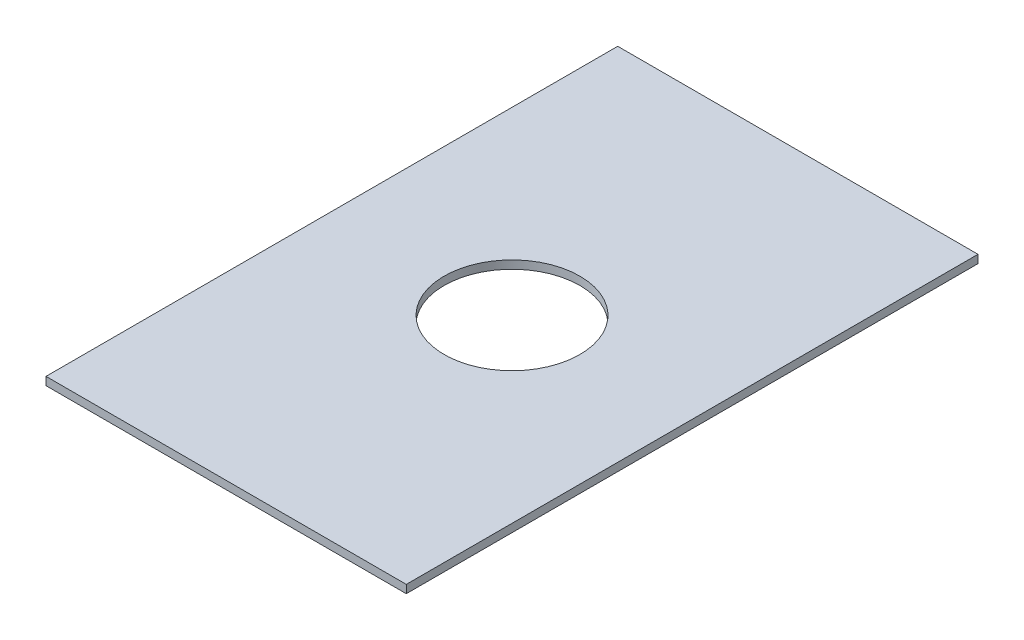
ISO-10303-21;
HEADER;
FILE_DESCRIPTION(('STEP AP214'),'2;1');
FILE_NAME('part.step','',(''),(''),'','','');
FILE_SCHEMA(('AUTOMOTIVE_DESIGN { 1 0 10303 214 1 1 1 1 }'));
ENDSEC;
DATA;
#1=APPLICATION_CONTEXT('core data for automotive mechanical design processes');
#2=APPLICATION_PROTOCOL_DEFINITION('international standard','automotive_design',2000,#1);
#3=PRODUCT_CONTEXT('',#1,'mechanical');
#4=PRODUCT('Part','Part','',(#3));
#5=PRODUCT_RELATED_PRODUCT_CATEGORY('part','',(#4));
#6=PRODUCT_DEFINITION_FORMATION('','',#4);
#7=PRODUCT_DEFINITION_CONTEXT('part definition',#1,'design');
#8=PRODUCT_DEFINITION('design','',#6,#7);
#9=PRODUCT_DEFINITION_SHAPE('','',#8);
#10=(LENGTH_UNIT() NAMED_UNIT(*) SI_UNIT(.MILLI.,.METRE.));
#11=(NAMED_UNIT(*) PLANE_ANGLE_UNIT() SI_UNIT($,.RADIAN.));
#12=(NAMED_UNIT(*) SI_UNIT($,.STERADIAN.) SOLID_ANGLE_UNIT());
#13=UNCERTAINTY_MEASURE_WITH_UNIT(LENGTH_MEASURE(1.E-05),#10,'distance_accuracy_value','');
#14=(GEOMETRIC_REPRESENTATION_CONTEXT(3) GLOBAL_UNCERTAINTY_ASSIGNED_CONTEXT((#13)) GLOBAL_UNIT_ASSIGNED_CONTEXT((#10,
#11,#12)) REPRESENTATION_CONTEXT('',''));
#15=CARTESIAN_POINT('',(0.,0.,0.));
#16=DIRECTION('',(0.,0.,1.));
#17=DIRECTION('',(1.,0.,0.));
#18=AXIS2_PLACEMENT_3D('',#15,#16,#17);
#19=CARTESIAN_POINT('',(-61.672,148.17,-97.864));
#20=DIRECTION('',(0.,1.,0.));
#21=DIRECTION('',(0.,0.,1.));
#22=AXIS2_PLACEMENT_3D('',#19,#20,#21);
#23=PLANE('',#22);
#24=CARTESIAN_POINT('',(0.,148.169999999987,0.));
#25=DIRECTION('',(0.,-1.,0.));
#26=DIRECTION('',(0.,0.,-1.));
#27=AXIS2_PLACEMENT_3D('',#24,#25,#26);
#28=CIRCLE('',#27,22.35);
#29=CARTESIAN_POINT('',(0.,148.169999999987,-22.35));
#30=VERTEX_POINT('',#29);
#31=EDGE_CURVE('E20',#30,#30,#28,.F.);
#32=ORIENTED_EDGE('',*,*,#31,.F.);
#33=EDGE_LOOP('',(#32));
#34=FACE_BOUND('',#33,.T.);
#35=DIRECTION('',(-1.,0.,0.));
#36=VECTOR('',#35,1.);
#37=CARTESIAN_POINT('',(0.,148.169999999987,94.1));
#38=LINE('',#37,#36);
#39=CARTESIAN_POINT('',(59.3,148.169999999993,94.1));
#40=VERTEX_POINT('',#39);
#41=CARTESIAN_POINT('',(-59.3,148.169999999993,94.1));
#42=VERTEX_POINT('',#41);
#43=EDGE_CURVE('E53',#40,#42,#38,.T.);
#44=ORIENTED_EDGE('',*,*,#43,.F.);
#45=DIRECTION('',(0.,0.,1.));
#46=VECTOR('',#45,1.);
#47=CARTESIAN_POINT('',(59.3,148.169999999987,0.));
#48=LINE('',#47,#46);
#49=CARTESIAN_POINT('',(59.3,148.16999999999,-94.1));
#50=VERTEX_POINT('',#49);
#51=EDGE_CURVE('E70',#50,#40,#48,.T.);
#52=ORIENTED_EDGE('',*,*,#51,.F.);
#53=DIRECTION('',(1.,0.,0.));
#54=VECTOR('',#53,1.);
#55=CARTESIAN_POINT('',(0.,148.169999999987,-94.1));
#56=LINE('',#55,#54);
#57=CARTESIAN_POINT('',(-59.3,148.169999999993,-94.1));
#58=VERTEX_POINT('',#57);
#59=EDGE_CURVE('E67',#58,#50,#56,.T.);
#60=ORIENTED_EDGE('',*,*,#59,.F.);
#61=DIRECTION('',(0.,0.,-1.));
#62=VECTOR('',#61,1.);
#63=CARTESIAN_POINT('',(-59.3,148.169999999987,0.));
#64=LINE('',#63,#62);
#65=EDGE_CURVE('E58',#42,#58,#64,.T.);
#66=ORIENTED_EDGE('',*,*,#65,.F.);
#67=EDGE_LOOP('',(#44,#52,#60,#66));
#68=FACE_BOUND('',#67,.T.);
#69=ADVANCED_FACE('F16',(#34,#68),#23,.T.);
#70=CARTESIAN_POINT('',(61.672,145.2330375427,-94.1));
#71=DIRECTION('',(0.,0.,-1.));
#72=DIRECTION('',(-1.,0.,0.));
#73=AXIS2_PLACEMENT_3D('',#70,#71,#72);
#74=PLANE('',#73);
#75=ORIENTED_EDGE('',*,*,#59,.T.);
#76=DIRECTION('',(0.,1.,0.));
#77=VECTOR('',#76,1.);
#78=CARTESIAN_POINT('',(59.3,146.835,-94.1000000000001));
#79=LINE('',#78,#77);
#80=CARTESIAN_POINT('',(59.3,145.50000000001,-94.1));
#81=VERTEX_POINT('',#80);
#82=EDGE_CURVE('E82',#81,#50,#79,.T.);
#83=ORIENTED_EDGE('',*,*,#82,.F.);
#84=DIRECTION('',(-1.,0.,0.));
#85=VECTOR('',#84,1.);
#86=CARTESIAN_POINT('',(0.,145.5,-94.1));
#87=LINE('',#86,#85);
#88=CARTESIAN_POINT('',(-59.3,145.50000000001,-94.1));
#89=VERTEX_POINT('',#88);
#90=EDGE_CURVE('E77',#81,#89,#87,.T.);
#91=ORIENTED_EDGE('',*,*,#90,.T.);
#92=DIRECTION('',(0.,-1.,0.));
#93=VECTOR('',#92,1.);
#94=CARTESIAN_POINT('',(-59.3,146.835,-94.1));
#95=LINE('',#94,#93);
#96=EDGE_CURVE('E63',#58,#89,#95,.T.);
#97=ORIENTED_EDGE('',*,*,#96,.F.);
#98=EDGE_LOOP('',(#75,#83,#91,#97));
#99=FACE_BOUND('',#98,.T.);
#100=ADVANCED_FACE('F76',(#99),#74,.T.);
#101=CARTESIAN_POINT('',(-59.3,145.2330375427,-97.864));
#102=DIRECTION('',(-1.,0.,0.));
#103=DIRECTION('',(0.,0.,1.));
#104=AXIS2_PLACEMENT_3D('',#101,#102,#103);
#105=PLANE('',#104);
#106=ORIENTED_EDGE('',*,*,#65,.T.);
#107=ORIENTED_EDGE('',*,*,#96,.T.);
#108=DIRECTION('',(0.,0.,1.));
#109=VECTOR('',#108,1.);
#110=CARTESIAN_POINT('',(-59.3,145.5,0.));
#111=LINE('',#110,#109);
#112=CARTESIAN_POINT('',(-59.3,145.50000000001,94.1));
#113=VERTEX_POINT('',#112);
#114=EDGE_CURVE('E87',#89,#113,#111,.T.);
#115=ORIENTED_EDGE('',*,*,#114,.T.);
#116=DIRECTION('',(0.,-1.,0.));
#117=VECTOR('',#116,1.);
#118=CARTESIAN_POINT('',(-59.3,146.835,94.1));
#119=LINE('',#118,#117);
#120=EDGE_CURVE('E65',#42,#113,#119,.T.);
#121=ORIENTED_EDGE('',*,*,#120,.F.);
#122=EDGE_LOOP('',(#106,#107,#115,#121));
#123=FACE_BOUND('',#122,.T.);
#124=ADVANCED_FACE('F60',(#123),#105,.T.);
#125=CARTESIAN_POINT('',(-61.672,145.2330375427,94.1));
#126=DIRECTION('',(0.,0.,1.));
#127=DIRECTION('',(1.,0.,0.));
#128=AXIS2_PLACEMENT_3D('',#125,#126,#127);
#129=PLANE('',#128);
#130=ORIENTED_EDGE('',*,*,#43,.T.);
#131=ORIENTED_EDGE('',*,*,#120,.T.);
#132=DIRECTION('',(1.,0.,0.));
#133=VECTOR('',#132,1.);
#134=CARTESIAN_POINT('',(0.,145.5,94.1));
#135=LINE('',#134,#133);
#136=CARTESIAN_POINT('',(59.3,145.50000000001,94.1));
#137=VERTEX_POINT('',#136);
#138=EDGE_CURVE('E89',#113,#137,#135,.T.);
#139=ORIENTED_EDGE('',*,*,#138,.T.);
#140=DIRECTION('',(0.,-1.,0.));
#141=VECTOR('',#140,1.);
#142=CARTESIAN_POINT('',(59.3,146.835,94.1));
#143=LINE('',#142,#141);
#144=EDGE_CURVE('E34',#40,#137,#143,.T.);
#145=ORIENTED_EDGE('',*,*,#144,.F.);
#146=EDGE_LOOP('',(#130,#131,#139,#145));
#147=FACE_BOUND('',#146,.T.);
#148=ADVANCED_FACE('F95',(#147),#129,.T.);
#149=CARTESIAN_POINT('',(59.3,145.2330375427,97.864));
#150=DIRECTION('',(1.,0.,0.));
#151=DIRECTION('',(0.,0.,-1.));
#152=AXIS2_PLACEMENT_3D('',#149,#150,#151);
#153=PLANE('',#152);
#154=ORIENTED_EDGE('',*,*,#51,.T.);
#155=ORIENTED_EDGE('',*,*,#144,.T.);
#156=DIRECTION('',(0.,0.,-1.));
#157=VECTOR('',#156,1.);
#158=CARTESIAN_POINT('',(59.3,145.5,0.));
#159=LINE('',#158,#157);
#160=EDGE_CURVE('E26',#137,#81,#159,.T.);
#161=ORIENTED_EDGE('',*,*,#160,.T.);
#162=ORIENTED_EDGE('',*,*,#82,.T.);
#163=EDGE_LOOP('',(#154,#155,#161,#162));
#164=FACE_BOUND('',#163,.T.);
#165=ADVANCED_FACE('F92',(#164),#153,.T.);
#166=CARTESIAN_POINT('',(0.,148.169999999987,0.));
#167=DIRECTION('',(0.,-1.,0.));
#168=DIRECTION('',(0.,0.,-1.));
#169=AXIS2_PLACEMENT_3D('',#166,#167,#168);
#170=CYLINDRICAL_SURFACE('',#169,22.35);
#171=ORIENTED_EDGE('',*,*,#31,.T.);
#172=EDGE_LOOP('',(#171));
#173=FACE_BOUND('',#172,.T.);
#174=CARTESIAN_POINT('',(0.,145.500000000013,0.));
#175=DIRECTION('',(0.,-1.,0.));
#176=DIRECTION('',(0.,0.,-1.));
#177=AXIS2_PLACEMENT_3D('',#174,#175,#176);
#178=CIRCLE('',#177,22.35);
#179=CARTESIAN_POINT('',(0.,145.500000000013,-22.35));
#180=VERTEX_POINT('',#179);
#181=EDGE_CURVE('E11',#180,#180,#178,.T.);
#182=ORIENTED_EDGE('',*,*,#181,.T.);
#183=EDGE_LOOP('',(#182));
#184=FACE_BOUND('',#183,.T.);
#185=ADVANCED_FACE('F103',(#173,#184),#170,.F.);
#186=CARTESIAN_POINT('',(-61.672,145.5,-97.864));
#187=DIRECTION('',(0.,1.,0.));
#188=DIRECTION('',(0.,0.,1.));
#189=AXIS2_PLACEMENT_3D('',#186,#187,#188);
#190=PLANE('',#189);
#191=ORIENTED_EDGE('',*,*,#181,.F.);
#192=EDGE_LOOP('',(#191));
#193=FACE_BOUND('',#192,.T.);
#194=ORIENTED_EDGE('',*,*,#138,.F.);
#195=ORIENTED_EDGE('',*,*,#114,.F.);
#196=ORIENTED_EDGE('',*,*,#90,.F.);
#197=ORIENTED_EDGE('',*,*,#160,.F.);
#198=EDGE_LOOP('',(#194,#195,#196,#197));
#199=FACE_BOUND('',#198,.T.);
#200=ADVANCED_FACE('F18',(#193,#199),#190,.F.);
#201=CLOSED_SHELL('',(#69,#100,#124,#148,#165,#185,#200));
#202=MANIFOLD_SOLID_BREP('B1',#201);
#203=ADVANCED_BREP_SHAPE_REPRESENTATION('',(#18,#202),#14);
#204=SHAPE_DEFINITION_REPRESENTATION(#9,#203);
ENDSEC;
END-ISO-10303-21;
